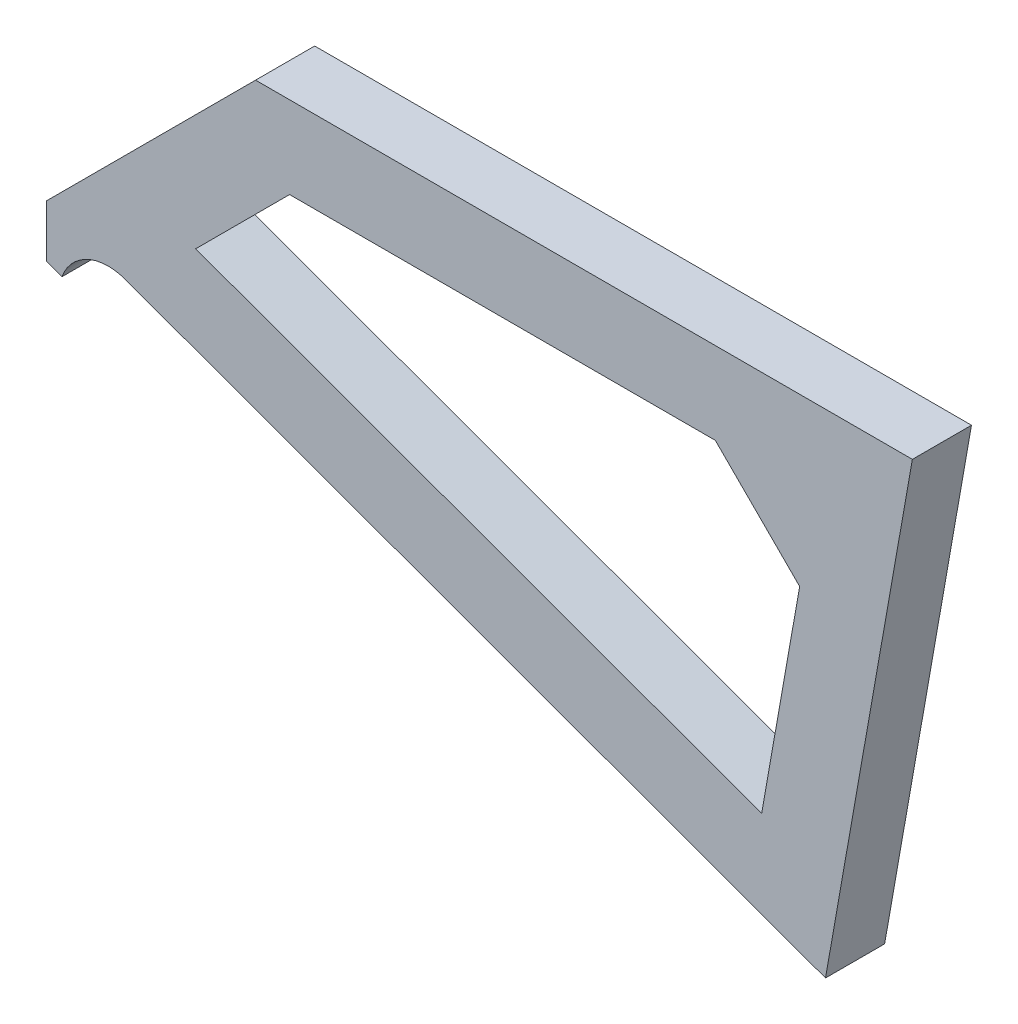
ISO-10303-21;
HEADER;
FILE_DESCRIPTION(('STEP AP214'),'2;1');
FILE_NAME('part.step','',(''),(''),'','','');
FILE_SCHEMA(('AUTOMOTIVE_DESIGN { 1 0 10303 214 1 1 1 1 }'));
ENDSEC;
DATA;
#1=APPLICATION_CONTEXT('core data for automotive mechanical design processes');
#2=APPLICATION_PROTOCOL_DEFINITION('international standard','automotive_design',2000,#1);
#3=PRODUCT_CONTEXT('',#1,'mechanical');
#4=PRODUCT('Part','Part','',(#3));
#5=PRODUCT_RELATED_PRODUCT_CATEGORY('part','',(#4));
#6=PRODUCT_DEFINITION_FORMATION('','',#4);
#7=PRODUCT_DEFINITION_CONTEXT('part definition',#1,'design');
#8=PRODUCT_DEFINITION('design','',#6,#7);
#9=PRODUCT_DEFINITION_SHAPE('','',#8);
#10=(LENGTH_UNIT() NAMED_UNIT(*) SI_UNIT(.MILLI.,.METRE.));
#11=(NAMED_UNIT(*) PLANE_ANGLE_UNIT() SI_UNIT($,.RADIAN.));
#12=(NAMED_UNIT(*) SI_UNIT($,.STERADIAN.) SOLID_ANGLE_UNIT());
#13=UNCERTAINTY_MEASURE_WITH_UNIT(LENGTH_MEASURE(1.E-05),#10,'distance_accuracy_value','');
#14=(GEOMETRIC_REPRESENTATION_CONTEXT(3) GLOBAL_UNCERTAINTY_ASSIGNED_CONTEXT((#13)) GLOBAL_UNIT_ASSIGNED_CONTEXT((#10,
#11,#12)) REPRESENTATION_CONTEXT('',''));
#15=CARTESIAN_POINT('',(0.,0.,0.));
#16=DIRECTION('',(0.,0.,1.));
#17=DIRECTION('',(1.,0.,0.));
#18=AXIS2_PLACEMENT_3D('',#15,#16,#17);
#19=CARTESIAN_POINT('',(-42.752517915708,-117.461577598239,18.));
#20=DIRECTION('',(0.342020143325663,0.93969262078591,0.));
#21=DIRECTION('',(-0.939692620785911,0.342020143325663,0.));
#22=AXIS2_PLACEMENT_3D('',#19,#20,#21);
#23=PLANE('',#22);
#24=DIRECTION('',(0.939692620785911,-0.342020143325663,0.));
#25=VECTOR('',#24,1.);
#26=CARTESIAN_POINT('',(-42.752517915708,-117.461577598239,0.));
#27=LINE('',#26,#25);
#28=CARTESIAN_POINT('',(-218.235614694557,-53.590953753884,0.));
#29=VERTEX_POINT('',#28);
#30=CARTESIAN_POINT('',(-45.8955949420254,-116.317591116654,0.));
#31=VERTEX_POINT('',#30);
#32=EDGE_CURVE('E192',#29,#31,#27,.T.);
#33=ORIENTED_EDGE('',*,*,#32,.F.);
#34=DIRECTION('',(0.,0.,-1.));
#35=VECTOR('',#34,1.);
#36=CARTESIAN_POINT('',(-218.235614694557,-53.590953753884,18.));
#37=LINE('',#36,#35);
#38=CARTESIAN_POINT('',(-218.235614694557,-53.590953753884,18.));
#39=VERTEX_POINT('',#38);
#40=EDGE_CURVE('E11',#39,#29,#37,.T.);
#41=ORIENTED_EDGE('',*,*,#40,.F.);
#42=DIRECTION('',(0.939692620785911,-0.342020143325663,0.));
#43=VECTOR('',#42,1.);
#44=CARTESIAN_POINT('',(-42.752517915708,-117.461577598239,18.));
#45=LINE('',#44,#43);
#46=CARTESIAN_POINT('',(-45.8955949420254,-116.317591116654,18.));
#47=VERTEX_POINT('',#46);
#48=EDGE_CURVE('E288',#39,#47,#45,.T.);
#49=ORIENTED_EDGE('',*,*,#48,.T.);
#50=DIRECTION('',(0.,0.,-1.));
#51=VECTOR('',#50,1.);
#52=CARTESIAN_POINT('',(-45.8955949420254,-116.317591116654,18.));
#53=LINE('',#52,#51);
#54=EDGE_CURVE('E59',#47,#31,#53,.T.);
#55=ORIENTED_EDGE('',*,*,#54,.T.);
#56=EDGE_LOOP('',(#33,#41,#49,#55));
#57=FACE_BOUND('',#56,.T.);
#58=ADVANCED_FACE('F39',(#57),#23,.T.);
#59=CARTESIAN_POINT('',(-82.3223304703354,82.3223304703362,18.));
#60=DIRECTION('',(0.707106781186544,-0.707106781186551,0.));
#61=DIRECTION('',(0.707106781186551,0.707106781186544,0.));
#62=AXIS2_PLACEMENT_3D('',#59,#60,#61);
#63=PLANE('',#62);
#64=DIRECTION('',(-0.707106781186551,-0.707106781186544,0.));
#65=VECTOR('',#64,1.);
#66=CARTESIAN_POINT('',(-82.3223304703354,82.3223304703362,0.));
#67=LINE('',#66,#65);
#68=CARTESIAN_POINT('',(-189.644660940673,-25.,0.));
#69=VERTEX_POINT('',#68);
#70=EDGE_CURVE('E195',#69,#29,#67,.T.);
#71=ORIENTED_EDGE('',*,*,#70,.F.);
#72=DIRECTION('',(0.,0.,-1.));
#73=VECTOR('',#72,1.);
#74=CARTESIAN_POINT('',(-189.644660940673,-25.,18.));
#75=LINE('',#74,#73);
#76=CARTESIAN_POINT('',(-189.644660940673,-25.,18.));
#77=VERTEX_POINT('',#76);
#78=EDGE_CURVE('E50',#77,#69,#75,.T.);
#79=ORIENTED_EDGE('',*,*,#78,.F.);
#80=DIRECTION('',(-0.707106781186551,-0.707106781186544,0.));
#81=VECTOR('',#80,1.);
#82=CARTESIAN_POINT('',(-82.3223304703354,82.3223304703362,18.));
#83=LINE('',#82,#81);
#84=EDGE_CURVE('E155',#77,#39,#83,.T.);
#85=ORIENTED_EDGE('',*,*,#84,.T.);
#86=ORIENTED_EDGE('',*,*,#40,.T.);
#87=EDGE_LOOP('',(#71,#79,#85,#86));
#88=FACE_BOUND('',#87,.T.);
#89=ADVANCED_FACE('F293',(#88),#63,.T.);
#90=CARTESIAN_POINT('',(0.,-25.,18.));
#91=DIRECTION('',(0.,-1.,0.));
#92=DIRECTION('',(1.,0.,0.));
#93=AXIS2_PLACEMENT_3D('',#90,#91,#92);
#94=PLANE('',#93);
#95=DIRECTION('',(-1.,0.,0.));
#96=VECTOR('',#95,1.);
#97=CARTESIAN_POINT('',(0.,-25.,0.));
#98=LINE('',#97,#96);
#99=CARTESIAN_POINT('',(-60.,-25.,0.));
#100=VERTEX_POINT('',#99);
#101=EDGE_CURVE('E141',#100,#69,#98,.T.);
#102=ORIENTED_EDGE('',*,*,#101,.F.);
#103=DIRECTION('',(0.,0.,-1.));
#104=VECTOR('',#103,1.);
#105=CARTESIAN_POINT('',(-60.,-25.,18.));
#106=LINE('',#105,#104);
#107=CARTESIAN_POINT('',(-60.,-25.,18.));
#108=VERTEX_POINT('',#107);
#109=EDGE_CURVE('E136',#108,#100,#106,.T.);
#110=ORIENTED_EDGE('',*,*,#109,.F.);
#111=DIRECTION('',(-1.,0.,0.));
#112=VECTOR('',#111,1.);
#113=CARTESIAN_POINT('',(0.,-25.,18.));
#114=LINE('',#113,#112);
#115=EDGE_CURVE('E139',#108,#77,#114,.T.);
#116=ORIENTED_EDGE('',*,*,#115,.T.);
#117=ORIENTED_EDGE('',*,*,#78,.T.);
#118=EDGE_LOOP('',(#102,#110,#116,#117));
#119=FACE_BOUND('',#118,.T.);
#120=ADVANCED_FACE('F138',(#119),#94,.T.);
#121=CARTESIAN_POINT('',(-42.5000000000001,-42.5,18.));
#122=DIRECTION('',(-0.707106781186549,-0.707106781186546,0.));
#123=DIRECTION('',(0.707106781186546,-0.707106781186549,0.));
#124=AXIS2_PLACEMENT_3D('',#121,#122,#123);
#125=PLANE('',#124);
#126=DIRECTION('',(-0.707106781186546,0.707106781186549,0.));
#127=VECTOR('',#126,1.);
#128=CARTESIAN_POINT('',(-42.5000000000001,-42.5,0.));
#129=LINE('',#128,#127);
#130=CARTESIAN_POINT('',(-34.3216293764236,-50.6783706235764,0.));
#131=VERTEX_POINT('',#130);
#132=EDGE_CURVE('E201',#131,#100,#129,.T.);
#133=ORIENTED_EDGE('',*,*,#132,.F.);
#134=DIRECTION('',(0.,0.,-1.));
#135=VECTOR('',#134,1.);
#136=CARTESIAN_POINT('',(-34.3216293764236,-50.6783706235764,18.));
#137=LINE('',#136,#135);
#138=CARTESIAN_POINT('',(-34.3216293764236,-50.6783706235764,18.));
#139=VERTEX_POINT('',#138);
#140=EDGE_CURVE('E96',#139,#131,#137,.T.);
#141=ORIENTED_EDGE('',*,*,#140,.F.);
#142=DIRECTION('',(-0.707106781186546,0.707106781186549,0.));
#143=VECTOR('',#142,1.);
#144=CARTESIAN_POINT('',(-42.5000000000001,-42.5,18.));
#145=LINE('',#144,#143);
#146=EDGE_CURVE('E153',#139,#108,#145,.T.);
#147=ORIENTED_EDGE('',*,*,#146,.T.);
#148=ORIENTED_EDGE('',*,*,#109,.T.);
#149=EDGE_LOOP('',(#133,#141,#147,#148));
#150=FACE_BOUND('',#149,.T.);
#151=ADVANCED_FACE('F158',(#150),#125,.T.);
#152=CARTESIAN_POINT('',(-244.867814706265,-86.4647365756348,18.));
#153=DIRECTION('',(0.,0.,-1.));
#154=DIRECTION('',(-1.,0.,0.));
#155=AXIS2_PLACEMENT_3D('',#152,#153,#154);
#156=CYLINDRICAL_SURFACE('',#155,15.);
#157=CARTESIAN_POINT('',(-244.867814706265,-86.4647365756348,0.));
#158=DIRECTION('',(0.,0.,1.));
#159=DIRECTION('',(1.,0.,0.));
#160=AXIS2_PLACEMENT_3D('',#157,#158,#159);
#161=CIRCLE('',#160,15.);
#162=CARTESIAN_POINT('',(-239.73751255638,-72.3693472638462,0.));
#163=VERTEX_POINT('',#162);
#164=CARTESIAN_POINT('',(-258.963204018054,-81.3344344257498,0.));
#165=VERTEX_POINT('',#164);
#166=EDGE_CURVE('E167',#163,#165,#161,.T.);
#167=ORIENTED_EDGE('',*,*,#166,.F.);
#168=DIRECTION('',(0.,0.,-1.));
#169=VECTOR('',#168,1.);
#170=CARTESIAN_POINT('',(-239.73751255638,-72.3693472638462,18.));
#171=LINE('',#170,#169);
#172=CARTESIAN_POINT('',(-239.73751255638,-72.3693472638462,18.));
#173=VERTEX_POINT('',#172);
#174=EDGE_CURVE('E43',#173,#163,#171,.T.);
#175=ORIENTED_EDGE('',*,*,#174,.F.);
#176=CARTESIAN_POINT('',(-244.867814706265,-86.4647365756348,18.));
#177=DIRECTION('',(0.,0.,1.));
#178=DIRECTION('',(1.,0.,0.));
#179=AXIS2_PLACEMENT_3D('',#176,#177,#178);
#180=CIRCLE('',#179,15.);
#181=CARTESIAN_POINT('',(-258.963204018054,-81.3344344257498,18.));
#182=VERTEX_POINT('',#181);
#183=EDGE_CURVE('E208',#173,#182,#180,.T.);
#184=ORIENTED_EDGE('',*,*,#183,.T.);
#185=DIRECTION('',(0.,0.,-1.));
#186=VECTOR('',#185,1.);
#187=CARTESIAN_POINT('',(-258.963204018054,-81.3344344257498,18.));
#188=LINE('',#187,#186);
#189=EDGE_CURVE('E163',#182,#165,#188,.T.);
#190=ORIENTED_EDGE('',*,*,#189,.T.);
#191=EDGE_LOOP('',(#167,#175,#184,#190));
#192=FACE_BOUND('',#191,.T.);
#193=ADVANCED_FACE('F41',(#192),#156,.F.);
#194=CARTESIAN_POINT('',(-51.3030214988495,-140.953893117887,18.));
#195=DIRECTION('',(0.342020143325663,0.939692620785911,0.));
#196=DIRECTION('',(-0.939692620785911,0.342020143325663,0.));
#197=AXIS2_PLACEMENT_3D('',#194,#195,#196);
#198=PLANE('',#197);
#199=DIRECTION('',(0.939692620785911,-0.342020143325663,0.));
#200=VECTOR('',#199,1.);
#201=CARTESIAN_POINT('',(-51.3030214988495,-140.953893117887,0.));
#202=LINE('',#201,#200);
#203=CARTESIAN_POINT('',(-26.4490471062703,-150.,0.));
#204=VERTEX_POINT('',#203);
#205=EDGE_CURVE('E171',#163,#204,#202,.T.);
#206=ORIENTED_EDGE('',*,*,#205,.T.);
#207=DIRECTION('',(0.,0.,-1.));
#208=VECTOR('',#207,1.);
#209=CARTESIAN_POINT('',(-26.4490471062703,-150.,18.));
#210=LINE('',#209,#208);
#211=CARTESIAN_POINT('',(-26.4490471062703,-150.,18.));
#212=VERTEX_POINT('',#211);
#213=EDGE_CURVE('E230',#212,#204,#210,.T.);
#214=ORIENTED_EDGE('',*,*,#213,.F.);
#215=DIRECTION('',(0.939692620785911,-0.342020143325663,0.));
#216=VECTOR('',#215,1.);
#217=CARTESIAN_POINT('',(-51.3030214988495,-140.953893117887,18.));
#218=LINE('',#217,#216);
#219=EDGE_CURVE('E241',#173,#212,#218,.T.);
#220=ORIENTED_EDGE('',*,*,#219,.F.);
#221=ORIENTED_EDGE('',*,*,#174,.T.);
#222=EDGE_LOOP('',(#206,#214,#220,#221));
#223=FACE_BOUND('',#222,.T.);
#224=ADVANCED_FACE('F240',(#223),#198,.F.);
#225=CARTESIAN_POINT('',(0.,0.,18.));
#226=DIRECTION('',(-0.984807753012208,0.173648177666931,0.));
#227=DIRECTION('',(-0.173648177666931,-0.984807753012208,0.));
#228=AXIS2_PLACEMENT_3D('',#225,#226,#227);
#229=PLANE('',#228);
#230=DIRECTION('',(0.173648177666931,0.984807753012208,0.));
#231=VECTOR('',#230,1.);
#232=CARTESIAN_POINT('',(0.,0.,0.));
#233=LINE('',#232,#231);
#234=CARTESIAN_POINT('',(0.,0.,0.));
#235=VERTEX_POINT('',#234);
#236=EDGE_CURVE('E174',#204,#235,#233,.T.);
#237=ORIENTED_EDGE('',*,*,#236,.T.);
#238=DIRECTION('',(0.,0.,-1.));
#239=VECTOR('',#238,1.);
#240=CARTESIAN_POINT('',(0.,0.,18.));
#241=LINE('',#240,#239);
#242=CARTESIAN_POINT('',(0.,0.,18.));
#243=VERTEX_POINT('',#242);
#244=EDGE_CURVE('E227',#243,#235,#241,.T.);
#245=ORIENTED_EDGE('',*,*,#244,.F.);
#246=DIRECTION('',(0.173648177666931,0.984807753012208,0.));
#247=VECTOR('',#246,1.);
#248=CARTESIAN_POINT('',(0.,0.,18.));
#249=LINE('',#248,#247);
#250=EDGE_CURVE('E270',#212,#243,#249,.T.);
#251=ORIENTED_EDGE('',*,*,#250,.F.);
#252=ORIENTED_EDGE('',*,*,#213,.T.);
#253=EDGE_LOOP('',(#237,#245,#251,#252));
#254=FACE_BOUND('',#253,.T.);
#255=ADVANCED_FACE('F269',(#254),#229,.F.);
#256=CARTESIAN_POINT('',(0.,0.,18.));
#257=DIRECTION('',(0.,-1.,0.));
#258=DIRECTION('',(1.,0.,0.));
#259=AXIS2_PLACEMENT_3D('',#256,#257,#258);
#260=PLANE('',#259);
#261=DIRECTION('',(-1.,0.,0.));
#262=VECTOR('',#261,1.);
#263=CARTESIAN_POINT('',(0.,0.,0.));
#264=LINE('',#263,#262);
#265=CARTESIAN_POINT('',(-200.,3.18287463642944E-12,0.));
#266=VERTEX_POINT('',#265);
#267=EDGE_CURVE('E177',#235,#266,#264,.T.);
#268=ORIENTED_EDGE('',*,*,#267,.T.);
#269=DIRECTION('',(0.,0.,-1.));
#270=VECTOR('',#269,1.);
#271=CARTESIAN_POINT('',(-200.,3.18287463642944E-12,18.));
#272=LINE('',#271,#270);
#273=CARTESIAN_POINT('',(-200.,3.18287463642944E-12,18.));
#274=VERTEX_POINT('',#273);
#275=EDGE_CURVE('E223',#274,#266,#272,.T.);
#276=ORIENTED_EDGE('',*,*,#275,.F.);
#277=DIRECTION('',(-1.,0.,0.));
#278=VECTOR('',#277,1.);
#279=CARTESIAN_POINT('',(0.,0.,18.));
#280=LINE('',#279,#278);
#281=EDGE_CURVE('E268',#243,#274,#280,.T.);
#282=ORIENTED_EDGE('',*,*,#281,.F.);
#283=ORIENTED_EDGE('',*,*,#244,.T.);
#284=EDGE_LOOP('',(#268,#276,#282,#283));
#285=FACE_BOUND('',#284,.T.);
#286=ADVANCED_FACE('F265',(#285),#260,.F.);
#287=CARTESIAN_POINT('',(-99.9999999999984,100.,18.));
#288=DIRECTION('',(0.707106781186542,-0.707106781186553,0.));
#289=DIRECTION('',(0.707106781186553,0.707106781186542,0.));
#290=AXIS2_PLACEMENT_3D('',#287,#288,#289);
#291=PLANE('',#290);
#292=DIRECTION('',(-0.707106781186553,-0.707106781186542,0.));
#293=VECTOR('',#292,1.);
#294=CARTESIAN_POINT('',(-99.9999999999984,100.,0.));
#295=LINE('',#294,#293);
#296=CARTESIAN_POINT('',(-263.661667121984,-63.6616671219829,0.));
#297=VERTEX_POINT('',#296);
#298=EDGE_CURVE('E180',#266,#297,#295,.T.);
#299=ORIENTED_EDGE('',*,*,#298,.T.);
#300=DIRECTION('',(0.,0.,-1.));
#301=VECTOR('',#300,1.);
#302=CARTESIAN_POINT('',(-263.661667121984,-63.6616671219829,18.));
#303=LINE('',#302,#301);
#304=CARTESIAN_POINT('',(-263.661667121984,-63.6616671219829,18.));
#305=VERTEX_POINT('',#304);
#306=EDGE_CURVE('E220',#305,#297,#303,.T.);
#307=ORIENTED_EDGE('',*,*,#306,.F.);
#308=DIRECTION('',(-0.707106781186553,-0.707106781186542,0.));
#309=VECTOR('',#308,1.);
#310=CARTESIAN_POINT('',(-99.9999999999984,100.,18.));
#311=LINE('',#310,#309);
#312=EDGE_CURVE('E276',#274,#305,#311,.T.);
#313=ORIENTED_EDGE('',*,*,#312,.F.);
#314=ORIENTED_EDGE('',*,*,#275,.T.);
#315=EDGE_LOOP('',(#299,#307,#313,#314));
#316=FACE_BOUND('',#315,.T.);
#317=ADVANCED_FACE('F262',(#316),#291,.F.);
#318=CARTESIAN_POINT('',(-263.661667121984,0.,18.));
#319=DIRECTION('',(-1.,0.,0.));
#320=DIRECTION('',(0.,0.,1.));
#321=AXIS2_PLACEMENT_3D('',#318,#319,#320);
#322=PLANE('',#321);
#323=DIRECTION('',(0.,1.,0.));
#324=VECTOR('',#323,1.);
#325=CARTESIAN_POINT('',(-263.661667121984,0.,0.));
#326=LINE('',#325,#324);
#327=CARTESIAN_POINT('',(-263.661667121984,-79.6243337091216,0.));
#328=VERTEX_POINT('',#327);
#329=EDGE_CURVE('E184',#328,#297,#326,.T.);
#330=ORIENTED_EDGE('',*,*,#329,.F.);
#331=DIRECTION('',(0.,0.,-1.));
#332=VECTOR('',#331,1.);
#333=CARTESIAN_POINT('',(-263.661667121984,-79.6243337091216,18.));
#334=LINE('',#333,#332);
#335=CARTESIAN_POINT('',(-263.661667121984,-79.6243337091216,18.));
#336=VERTEX_POINT('',#335);
#337=EDGE_CURVE('E217',#336,#328,#334,.T.);
#338=ORIENTED_EDGE('',*,*,#337,.F.);
#339=DIRECTION('',(0.,1.,0.));
#340=VECTOR('',#339,1.);
#341=CARTESIAN_POINT('',(-263.661667121984,0.,18.));
#342=LINE('',#341,#340);
#343=EDGE_CURVE('E259',#336,#305,#342,.T.);
#344=ORIENTED_EDGE('',*,*,#343,.T.);
#345=ORIENTED_EDGE('',*,*,#306,.T.);
#346=EDGE_LOOP('',(#330,#338,#344,#345));
#347=FACE_BOUND('',#346,.T.);
#348=ADVANCED_FACE('F255',(#347),#322,.T.);
#349=CARTESIAN_POINT('',(-56.4333236487344,-155.049282429675,18.));
#350=DIRECTION('',(0.342020143325662,0.939692620785911,0.));
#351=DIRECTION('',(-0.939692620785911,0.342020143325662,0.));
#352=AXIS2_PLACEMENT_3D('',#349,#350,#351);
#353=PLANE('',#352);
#354=DIRECTION('',(0.939692620785911,-0.342020143325662,0.));
#355=VECTOR('',#354,1.);
#356=CARTESIAN_POINT('',(-56.4333236487344,-155.049282429675,0.));
#357=LINE('',#356,#355);
#358=EDGE_CURVE('E188',#328,#165,#357,.T.);
#359=ORIENTED_EDGE('',*,*,#358,.T.);
#360=ORIENTED_EDGE('',*,*,#189,.F.);
#361=DIRECTION('',(0.939692620785911,-0.342020143325662,0.));
#362=VECTOR('',#361,1.);
#363=CARTESIAN_POINT('',(-56.4333236487344,-155.049282429675,18.));
#364=LINE('',#363,#362);
#365=EDGE_CURVE('E285',#336,#182,#364,.T.);
#366=ORIENTED_EDGE('',*,*,#365,.F.);
#367=ORIENTED_EDGE('',*,*,#337,.T.);
#368=EDGE_LOOP('',(#359,#360,#366,#367));
#369=FACE_BOUND('',#368,.T.);
#370=ADVANCED_FACE('F251',(#369),#353,.F.);
#371=CARTESIAN_POINT('',(-24.6201938253052,4.34120444167335,18.));
#372=DIRECTION('',(-0.984807753012207,0.173648177666934,0.));
#373=DIRECTION('',(-0.173648177666934,-0.984807753012207,0.));
#374=AXIS2_PLACEMENT_3D('',#371,#372,#373);
#375=PLANE('',#374);
#376=DIRECTION('',(0.173648177666934,0.984807753012208,0.));
#377=VECTOR('',#376,1.);
#378=CARTESIAN_POINT('',(-24.6201938253052,4.34120444167335,0.));
#379=LINE('',#378,#377);
#380=EDGE_CURVE('E204',#31,#131,#379,.T.);
#381=ORIENTED_EDGE('',*,*,#380,.F.);
#382=ORIENTED_EDGE('',*,*,#54,.F.);
#383=DIRECTION('',(0.173648177666934,0.984807753012208,0.));
#384=VECTOR('',#383,1.);
#385=CARTESIAN_POINT('',(-24.6201938253052,4.34120444167335,18.));
#386=LINE('',#385,#384);
#387=EDGE_CURVE('E160',#47,#139,#386,.T.);
#388=ORIENTED_EDGE('',*,*,#387,.T.);
#389=ORIENTED_EDGE('',*,*,#140,.T.);
#390=EDGE_LOOP('',(#381,#382,#388,#389));
#391=FACE_BOUND('',#390,.T.);
#392=ADVANCED_FACE('F294',(#391),#375,.T.);
#393=CARTESIAN_POINT('',(0.,0.,18.));
#394=DIRECTION('',(0.,0.,1.));
#395=DIRECTION('',(1.,0.,0.));
#396=AXIS2_PLACEMENT_3D('',#393,#394,#395);
#397=PLANE('',#396);
#398=ORIENTED_EDGE('',*,*,#183,.F.);
#399=ORIENTED_EDGE('',*,*,#219,.T.);
#400=ORIENTED_EDGE('',*,*,#250,.T.);
#401=ORIENTED_EDGE('',*,*,#281,.T.);
#402=ORIENTED_EDGE('',*,*,#312,.T.);
#403=ORIENTED_EDGE('',*,*,#343,.F.);
#404=ORIENTED_EDGE('',*,*,#365,.T.);
#405=EDGE_LOOP('',(#398,#399,#400,#401,#402,#403,#404));
#406=FACE_BOUND('',#405,.T.);
#407=ORIENTED_EDGE('',*,*,#48,.F.);
#408=ORIENTED_EDGE('',*,*,#84,.F.);
#409=ORIENTED_EDGE('',*,*,#115,.F.);
#410=ORIENTED_EDGE('',*,*,#146,.F.);
#411=ORIENTED_EDGE('',*,*,#387,.F.);
#412=EDGE_LOOP('',(#407,#408,#409,#410,#411));
#413=FACE_BOUND('',#412,.T.);
#414=ADVANCED_FACE('F151',(#406,#413),#397,.T.);
#415=CARTESIAN_POINT('',(0.,0.,0.));
#416=DIRECTION('',(0.,0.,1.));
#417=DIRECTION('',(1.,0.,0.));
#418=AXIS2_PLACEMENT_3D('',#415,#416,#417);
#419=PLANE('',#418);
#420=ORIENTED_EDGE('',*,*,#166,.T.);
#421=ORIENTED_EDGE('',*,*,#358,.F.);
#422=ORIENTED_EDGE('',*,*,#329,.T.);
#423=ORIENTED_EDGE('',*,*,#298,.F.);
#424=ORIENTED_EDGE('',*,*,#267,.F.);
#425=ORIENTED_EDGE('',*,*,#236,.F.);
#426=ORIENTED_EDGE('',*,*,#205,.F.);
#427=EDGE_LOOP('',(#420,#421,#422,#423,#424,#425,#426));
#428=FACE_BOUND('',#427,.T.);
#429=ORIENTED_EDGE('',*,*,#32,.T.);
#430=ORIENTED_EDGE('',*,*,#380,.T.);
#431=ORIENTED_EDGE('',*,*,#132,.T.);
#432=ORIENTED_EDGE('',*,*,#101,.T.);
#433=ORIENTED_EDGE('',*,*,#70,.T.);
#434=EDGE_LOOP('',(#429,#430,#431,#432,#433));
#435=FACE_BOUND('',#434,.T.);
#436=ADVANCED_FACE('F244',(#428,#435),#419,.F.);
#437=CLOSED_SHELL('',(#58,#89,#120,#151,#193,#224,#255,#286,#317,#348,#370,#392,#414,#436));
#438=MANIFOLD_SOLID_BREP('B2',#437);
#439=ADVANCED_BREP_SHAPE_REPRESENTATION('',(#18,#438),#14);
#440=SHAPE_DEFINITION_REPRESENTATION(#9,#439);
ENDSEC;
END-ISO-10303-21;
